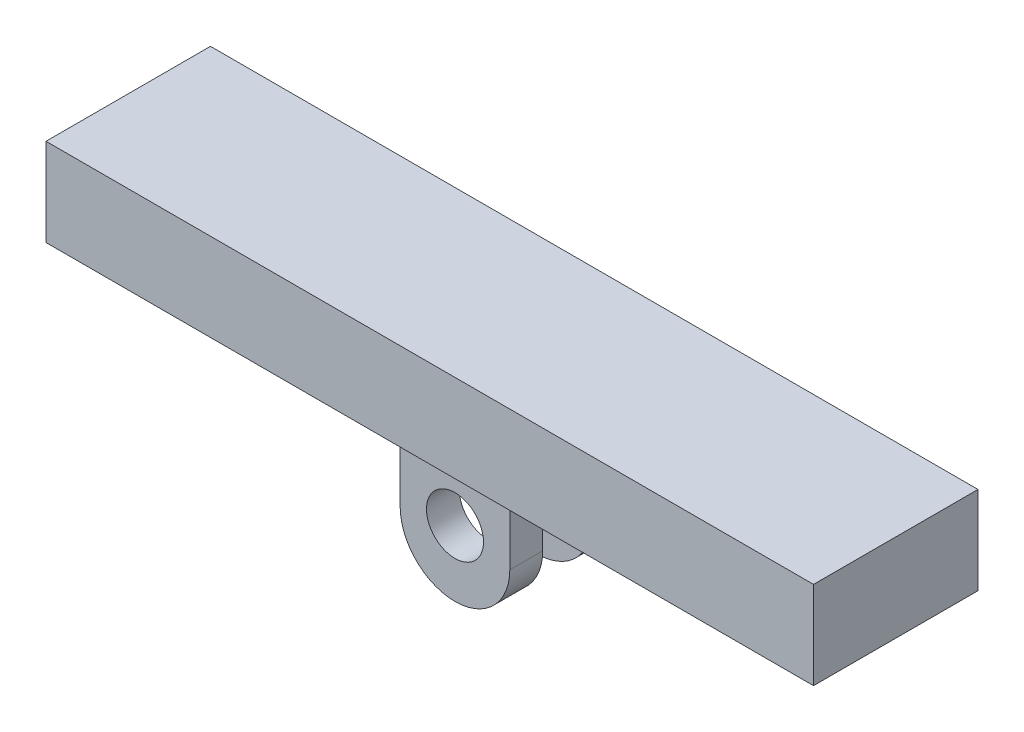
ISO-10303-21;
HEADER;
FILE_DESCRIPTION(('STEP AP214'),'2;1');
FILE_NAME('part.step','',(''),(''),'','','');
FILE_SCHEMA(('AUTOMOTIVE_DESIGN { 1 0 10303 214 1 1 1 1 }'));
ENDSEC;
DATA;
#1=APPLICATION_CONTEXT('core data for automotive mechanical design processes');
#2=APPLICATION_PROTOCOL_DEFINITION('international standard','automotive_design',2000,#1);
#3=PRODUCT_CONTEXT('',#1,'mechanical');
#4=PRODUCT('Part','Part','',(#3));
#5=PRODUCT_RELATED_PRODUCT_CATEGORY('part','',(#4));
#6=PRODUCT_DEFINITION_FORMATION('','',#4);
#7=PRODUCT_DEFINITION_CONTEXT('part definition',#1,'design');
#8=PRODUCT_DEFINITION('design','',#6,#7);
#9=PRODUCT_DEFINITION_SHAPE('','',#8);
#10=(LENGTH_UNIT() NAMED_UNIT(*) SI_UNIT(.MILLI.,.METRE.));
#11=(NAMED_UNIT(*) PLANE_ANGLE_UNIT() SI_UNIT($,.RADIAN.));
#12=(NAMED_UNIT(*) SI_UNIT($,.STERADIAN.) SOLID_ANGLE_UNIT());
#13=UNCERTAINTY_MEASURE_WITH_UNIT(LENGTH_MEASURE(1.E-05),#10,'distance_accuracy_value','');
#14=(GEOMETRIC_REPRESENTATION_CONTEXT(3) GLOBAL_UNCERTAINTY_ASSIGNED_CONTEXT((#13)) GLOBAL_UNIT_ASSIGNED_CONTEXT((#10,
#11,#12)) REPRESENTATION_CONTEXT('',''));
#15=CARTESIAN_POINT('',(0.,0.,0.));
#16=DIRECTION('',(0.,0.,1.));
#17=DIRECTION('',(1.,0.,0.));
#18=AXIS2_PLACEMENT_3D('',#15,#16,#17);
#19=CARTESIAN_POINT('',(-24.5,-2.96691783114937,-12.7508874073065));
#20=DIRECTION('',(0.,-1.,0.));
#21=DIRECTION('',(1.,0.,0.));
#22=AXIS2_PLACEMENT_3D('',#19,#20,#21);
#23=PLANE('',#22);
#24=DIRECTION('',(1.,0.,0.));
#25=VECTOR('',#24,1.);
#26=CARTESIAN_POINT('',(-24.5,-2.96691783114937,-2.25088740730654));
#27=LINE('',#26,#25);
#28=CARTESIAN_POINT('',(-24.5,-2.96691783114937,-2.25088740730654));
#29=VERTEX_POINT('',#28);
#30=CARTESIAN_POINT('',(24.5,-2.96691783114937,-2.25088740730654));
#31=VERTEX_POINT('',#30);
#32=EDGE_CURVE('E217',#29,#31,#27,.T.);
#33=ORIENTED_EDGE('',*,*,#32,.F.);
#34=DIRECTION('',(0.,0.,1.));
#35=VECTOR('',#34,1.);
#36=CARTESIAN_POINT('',(-24.5,-2.96691783114937,-12.7508874073065));
#37=LINE('',#36,#35);
#38=CARTESIAN_POINT('',(-24.5,-2.96691783114937,-12.7508874073065));
#39=VERTEX_POINT('',#38);
#40=EDGE_CURVE('E227',#39,#29,#37,.T.);
#41=ORIENTED_EDGE('',*,*,#40,.F.);
#42=DIRECTION('',(1.,0.,0.));
#43=VECTOR('',#42,1.);
#44=CARTESIAN_POINT('',(-24.5,-2.96691783114937,-12.7508874073065));
#45=LINE('',#44,#43);
#46=CARTESIAN_POINT('',(24.5,-2.96691783114937,-12.7508874073065));
#47=VERTEX_POINT('',#46);
#48=EDGE_CURVE('E205',#39,#47,#45,.T.);
#49=ORIENTED_EDGE('',*,*,#48,.T.);
#50=DIRECTION('',(0.,0.,1.));
#51=VECTOR('',#50,1.);
#52=CARTESIAN_POINT('',(24.5,-2.96691783114937,-12.7508874073065));
#53=LINE('',#52,#51);
#54=EDGE_CURVE('E225',#47,#31,#53,.T.);
#55=ORIENTED_EDGE('',*,*,#54,.T.);
#56=EDGE_LOOP('',(#33,#41,#49,#55));
#57=FACE_BOUND('',#56,.T.);
#58=DIRECTION('',(-1.,0.,0.));
#59=VECTOR('',#58,1.);
#60=CARTESIAN_POINT('',(-3.49999999999999,-2.96691783114937,-9.11088740730654));
#61=LINE('',#60,#59);
#62=CARTESIAN_POINT('',(3.50000000000001,-2.96691783114937,-9.11088740730654));
#63=VERTEX_POINT('',#62);
#64=CARTESIAN_POINT('',(-3.49999999999999,-2.96691783114937,-9.11088740730654));
#65=VERTEX_POINT('',#64);
#66=EDGE_CURVE('E193',#63,#65,#61,.T.);
#67=ORIENTED_EDGE('',*,*,#66,.F.);
#68=DIRECTION('',(0.,0.,1.));
#69=VECTOR('',#68,1.);
#70=CARTESIAN_POINT('',(3.50000000000001,-2.96691783114937,-9.11088740730654));
#71=LINE('',#70,#69);
#72=CARTESIAN_POINT('',(3.5,-2.96691783114937,-11.2108874073065));
#73=VERTEX_POINT('',#72);
#74=EDGE_CURVE('E164',#73,#63,#71,.T.);
#75=ORIENTED_EDGE('',*,*,#74,.F.);
#76=DIRECTION('',(1.,0.,0.));
#77=VECTOR('',#76,1.);
#78=CARTESIAN_POINT('',(-3.49999999999999,-2.96691783114937,-11.2108874073065));
#79=LINE('',#78,#77);
#80=CARTESIAN_POINT('',(-3.49999999999999,-2.96691783114937,-11.2108874073065));
#81=VERTEX_POINT('',#80);
#82=EDGE_CURVE('E187',#81,#73,#79,.T.);
#83=ORIENTED_EDGE('',*,*,#82,.F.);
#84=DIRECTION('',(0.,0.,-1.));
#85=VECTOR('',#84,1.);
#86=CARTESIAN_POINT('',(-3.49999999999999,-2.96691783114937,-9.11088740730654));
#87=LINE('',#86,#85);
#88=EDGE_CURVE('E190',#65,#81,#87,.T.);
#89=ORIENTED_EDGE('',*,*,#88,.F.);
#90=EDGE_LOOP('',(#67,#75,#83,#89));
#91=FACE_BOUND('',#90,.T.);
#92=DIRECTION('',(-1.,0.,0.));
#93=VECTOR('',#92,1.);
#94=CARTESIAN_POINT('',(-3.5,-2.96691783114937,-3.86088740730654));
#95=LINE('',#94,#93);
#96=CARTESIAN_POINT('',(3.5,-2.96691783114937,-3.86088740730654));
#97=VERTEX_POINT('',#96);
#98=CARTESIAN_POINT('',(-3.5,-2.96691783114937,-3.86088740730654));
#99=VERTEX_POINT('',#98);
#100=EDGE_CURVE('E147',#97,#99,#95,.T.);
#101=ORIENTED_EDGE('',*,*,#100,.F.);
#102=DIRECTION('',(0.,0.,1.));
#103=VECTOR('',#102,1.);
#104=CARTESIAN_POINT('',(3.5,-2.96691783114937,-3.86088740730654));
#105=LINE('',#104,#103);
#106=CARTESIAN_POINT('',(3.5,-2.96691783114937,-5.96088740730654));
#107=VERTEX_POINT('',#106);
#108=EDGE_CURVE('E158',#107,#97,#105,.T.);
#109=ORIENTED_EDGE('',*,*,#108,.F.);
#110=DIRECTION('',(1.,0.,0.));
#111=VECTOR('',#110,1.);
#112=CARTESIAN_POINT('',(-3.5,-2.96691783114937,-5.96088740730654));
#113=LINE('',#112,#111);
#114=CARTESIAN_POINT('',(-3.5,-2.96691783114937,-5.96088740730654));
#115=VERTEX_POINT('',#114);
#116=EDGE_CURVE('E169',#115,#107,#113,.T.);
#117=ORIENTED_EDGE('',*,*,#116,.F.);
#118=DIRECTION('',(0.,0.,-1.));
#119=VECTOR('',#118,1.);
#120=CARTESIAN_POINT('',(-3.5,-2.96691783114937,-3.86088740730654));
#121=LINE('',#120,#119);
#122=EDGE_CURVE('E167',#99,#115,#121,.T.);
#123=ORIENTED_EDGE('',*,*,#122,.F.);
#124=EDGE_LOOP('',(#101,#109,#117,#123));
#125=FACE_BOUND('',#124,.T.);
#126=ADVANCED_FACE('F43',(#57,#91,#125),#23,.T.);
#127=CARTESIAN_POINT('',(-24.5,2.63308216885063,-12.7508874073065));
#128=DIRECTION('',(0.,1.,0.));
#129=DIRECTION('',(-1.,0.,0.));
#130=AXIS2_PLACEMENT_3D('',#127,#128,#129);
#131=PLANE('',#130);
#132=DIRECTION('',(-1.,0.,0.));
#133=VECTOR('',#132,1.);
#134=CARTESIAN_POINT('',(-24.5,2.63308216885063,-2.25088740730654));
#135=LINE('',#134,#133);
#136=CARTESIAN_POINT('',(24.5,2.63308216885063,-2.25088740730654));
#137=VERTEX_POINT('',#136);
#138=CARTESIAN_POINT('',(-24.5,2.63308216885063,-2.25088740730654));
#139=VERTEX_POINT('',#138);
#140=EDGE_CURVE('E154',#137,#139,#135,.T.);
#141=ORIENTED_EDGE('',*,*,#140,.F.);
#142=DIRECTION('',(0.,0.,1.));
#143=VECTOR('',#142,1.);
#144=CARTESIAN_POINT('',(24.5,2.63308216885063,-12.7508874073065));
#145=LINE('',#144,#143);
#146=CARTESIAN_POINT('',(24.5,2.63308216885063,-12.7508874073065));
#147=VERTEX_POINT('',#146);
#148=EDGE_CURVE('E222',#147,#137,#145,.T.);
#149=ORIENTED_EDGE('',*,*,#148,.F.);
#150=DIRECTION('',(-1.,0.,0.));
#151=VECTOR('',#150,1.);
#152=CARTESIAN_POINT('',(-24.5,2.63308216885063,-12.7508874073065));
#153=LINE('',#152,#151);
#154=CARTESIAN_POINT('',(-24.5,2.63308216885063,-12.7508874073065));
#155=VERTEX_POINT('',#154);
#156=EDGE_CURVE('E198',#147,#155,#153,.T.);
#157=ORIENTED_EDGE('',*,*,#156,.T.);
#158=DIRECTION('',(0.,0.,1.));
#159=VECTOR('',#158,1.);
#160=CARTESIAN_POINT('',(-24.5,2.63308216885063,-12.7508874073065));
#161=LINE('',#160,#159);
#162=EDGE_CURVE('E211',#155,#139,#161,.T.);
#163=ORIENTED_EDGE('',*,*,#162,.T.);
#164=EDGE_LOOP('',(#141,#149,#157,#163));
#165=FACE_BOUND('',#164,.T.);
#166=ADVANCED_FACE('F283',(#165),#131,.T.);
#167=CARTESIAN_POINT('',(24.5,-2.96691783114937,-12.7508874073065));
#168=DIRECTION('',(1.,0.,0.));
#169=DIRECTION('',(0.,0.,-1.));
#170=AXIS2_PLACEMENT_3D('',#167,#168,#169);
#171=PLANE('',#170);
#172=DIRECTION('',(0.,1.,0.));
#173=VECTOR('',#172,1.);
#174=CARTESIAN_POINT('',(24.5,-2.96691783114937,-2.25088740730654));
#175=LINE('',#174,#173);
#176=EDGE_CURVE('E202',#31,#137,#175,.T.);
#177=ORIENTED_EDGE('',*,*,#176,.F.);
#178=ORIENTED_EDGE('',*,*,#54,.F.);
#179=DIRECTION('',(0.,1.,0.));
#180=VECTOR('',#179,1.);
#181=CARTESIAN_POINT('',(24.5,-2.96691783114937,-12.7508874073065));
#182=LINE('',#181,#180);
#183=EDGE_CURVE('E208',#47,#147,#182,.T.);
#184=ORIENTED_EDGE('',*,*,#183,.T.);
#185=ORIENTED_EDGE('',*,*,#148,.T.);
#186=EDGE_LOOP('',(#177,#178,#184,#185));
#187=FACE_BOUND('',#186,.T.);
#188=ADVANCED_FACE('F289',(#187),#171,.T.);
#189=CARTESIAN_POINT('',(-24.5,-2.96691783114937,-12.7508874073065));
#190=DIRECTION('',(-1.,0.,0.));
#191=DIRECTION('',(0.,0.,1.));
#192=AXIS2_PLACEMENT_3D('',#189,#190,#191);
#193=PLANE('',#192);
#194=DIRECTION('',(0.,-1.,0.));
#195=VECTOR('',#194,1.);
#196=CARTESIAN_POINT('',(-24.5,-2.96691783114937,-2.25088740730654));
#197=LINE('',#196,#195);
#198=EDGE_CURVE('E214',#139,#29,#197,.T.);
#199=ORIENTED_EDGE('',*,*,#198,.F.);
#200=ORIENTED_EDGE('',*,*,#162,.F.);
#201=DIRECTION('',(0.,-1.,0.));
#202=VECTOR('',#201,1.);
#203=CARTESIAN_POINT('',(-24.5,-2.96691783114937,-12.7508874073065));
#204=LINE('',#203,#202);
#205=EDGE_CURVE('E201',#155,#39,#204,.T.);
#206=ORIENTED_EDGE('',*,*,#205,.T.);
#207=ORIENTED_EDGE('',*,*,#40,.T.);
#208=EDGE_LOOP('',(#199,#200,#206,#207));
#209=FACE_BOUND('',#208,.T.);
#210=ADVANCED_FACE('F297',(#209),#193,.T.);
#211=CARTESIAN_POINT('',(0.,-0.166917831149369,-12.7508874073065));
#212=DIRECTION('',(0.,0.,1.));
#213=DIRECTION('',(1.,0.,0.));
#214=AXIS2_PLACEMENT_3D('',#211,#212,#213);
#215=PLANE('',#214);
#216=ORIENTED_EDGE('',*,*,#156,.F.);
#217=ORIENTED_EDGE('',*,*,#183,.F.);
#218=ORIENTED_EDGE('',*,*,#48,.F.);
#219=ORIENTED_EDGE('',*,*,#205,.F.);
#220=EDGE_LOOP('',(#216,#217,#218,#219));
#221=FACE_BOUND('',#220,.T.);
#222=ADVANCED_FACE('F299',(#221),#215,.F.);
#223=CARTESIAN_POINT('',(0.,-0.166917831149369,-2.25088740730654));
#224=DIRECTION('',(0.,0.,1.));
#225=DIRECTION('',(1.,0.,0.));
#226=AXIS2_PLACEMENT_3D('',#223,#224,#225);
#227=PLANE('',#226);
#228=ORIENTED_EDGE('',*,*,#140,.T.);
#229=ORIENTED_EDGE('',*,*,#198,.T.);
#230=ORIENTED_EDGE('',*,*,#32,.T.);
#231=ORIENTED_EDGE('',*,*,#176,.T.);
#232=EDGE_LOOP('',(#228,#229,#230,#231));
#233=FACE_BOUND('',#232,.T.);
#234=ADVANCED_FACE('F403',(#233),#227,.T.);
#235=CARTESIAN_POINT('',(3.50000000000001,-11.3669178311494,-9.11088740730654));
#236=DIRECTION('',(-1.,0.,0.));
#237=DIRECTION('',(0.,0.,1.));
#238=AXIS2_PLACEMENT_3D('',#235,#236,#237);
#239=PLANE('',#238);
#240=DIRECTION('',(0.,1.,0.));
#241=VECTOR('',#240,1.);
#242=CARTESIAN_POINT('',(3.50000000000001,-11.3669178311494,-9.11088740730654));
#243=LINE('',#242,#241);
#244=CARTESIAN_POINT('',(3.50000000000001,-7.86691783114937,-9.11088740730654));
#245=VERTEX_POINT('',#244);
#246=EDGE_CURVE('E178',#245,#63,#243,.T.);
#247=ORIENTED_EDGE('',*,*,#246,.F.);
#248=DIRECTION('',(0.,0.,1.));
#249=VECTOR('',#248,1.);
#250=CARTESIAN_POINT('',(3.50000000000001,-7.86691783114937,-11.2108874073065));
#251=LINE('',#250,#249);
#252=CARTESIAN_POINT('',(3.50000000000001,-7.86691783114937,-11.2108874073065));
#253=VERTEX_POINT('',#252);
#254=EDGE_CURVE('E245',#245,#253,#251,.F.);
#255=ORIENTED_EDGE('',*,*,#254,.T.);
#256=DIRECTION('',(0.,1.,0.));
#257=VECTOR('',#256,1.);
#258=CARTESIAN_POINT('',(3.50000000000001,-11.3669178311494,-11.2108874073065));
#259=LINE('',#258,#257);
#260=EDGE_CURVE('E185',#253,#73,#259,.T.);
#261=ORIENTED_EDGE('',*,*,#260,.T.);
#262=ORIENTED_EDGE('',*,*,#74,.T.);
#263=EDGE_LOOP('',(#247,#255,#261,#262));
#264=FACE_BOUND('',#263,.T.);
#265=ADVANCED_FACE('F394',(#264),#239,.F.);
#266=CARTESIAN_POINT('',(-3.49999999999999,-11.3669178311494,-9.11088740730654));
#267=DIRECTION('',(0.,0.,-1.));
#268=DIRECTION('',(-1.,0.,0.));
#269=AXIS2_PLACEMENT_3D('',#266,#267,#268);
#270=PLANE('',#269);
#271=CARTESIAN_POINT('',(0.,-7.16691783114937,-9.11088740730654));
#272=DIRECTION('',(0.,0.,-1.));
#273=DIRECTION('',(-1.,0.,0.));
#274=AXIS2_PLACEMENT_3D('',#271,#272,#273);
#275=CIRCLE('',#274,1.82);
#276=CARTESIAN_POINT('',(-1.82,-7.16691783114937,-9.11088740730654));
#277=VERTEX_POINT('',#276);
#278=EDGE_CURVE('E181',#277,#277,#275,.T.);
#279=ORIENTED_EDGE('',*,*,#278,.T.);
#280=EDGE_LOOP('',(#279));
#281=FACE_BOUND('',#280,.T.);
#282=DIRECTION('',(0.,1.,0.));
#283=VECTOR('',#282,1.);
#284=CARTESIAN_POINT('',(-3.49999999999999,-11.3669178311494,-9.11088740730654));
#285=LINE('',#284,#283);
#286=CARTESIAN_POINT('',(-3.49999999999999,-7.86691783114937,-9.11088740730654));
#287=VERTEX_POINT('',#286);
#288=EDGE_CURVE('E180',#287,#65,#285,.T.);
#289=ORIENTED_EDGE('',*,*,#288,.F.);
#290=CARTESIAN_POINT('',(0.,-7.86691783114937,-9.11088740730654));
#291=DIRECTION('',(0.,0.,-1.));
#292=DIRECTION('',(-1.,0.,0.));
#293=AXIS2_PLACEMENT_3D('',#290,#291,#292);
#294=CIRCLE('',#293,3.5);
#295=CARTESIAN_POINT('',(0.,-11.3669178311494,-9.11088740730654));
#296=VERTEX_POINT('',#295);
#297=EDGE_CURVE('E243',#287,#296,#294,.F.);
#298=ORIENTED_EDGE('',*,*,#297,.T.);
#299=CARTESIAN_POINT('',(0.,-7.86691783114937,-9.11088740730654));
#300=DIRECTION('',(0.,0.,-1.));
#301=DIRECTION('',(-1.,0.,0.));
#302=AXIS2_PLACEMENT_3D('',#299,#300,#301);
#303=CIRCLE('',#302,3.5);
#304=EDGE_CURVE('E241',#296,#245,#303,.F.);
#305=ORIENTED_EDGE('',*,*,#304,.T.);
#306=ORIENTED_EDGE('',*,*,#246,.T.);
#307=ORIENTED_EDGE('',*,*,#66,.T.);
#308=EDGE_LOOP('',(#289,#298,#305,#306,#307));
#309=FACE_BOUND('',#308,.T.);
#310=ADVANCED_FACE('F384',(#281,#309),#270,.F.);
#311=CARTESIAN_POINT('',(-3.49999999999999,-11.3669178311494,-9.11088740730654));
#312=DIRECTION('',(1.,0.,0.));
#313=DIRECTION('',(0.,1.,0.));
#314=AXIS2_PLACEMENT_3D('',#311,#312,#313);
#315=PLANE('',#314);
#316=DIRECTION('',(0.,1.,0.));
#317=VECTOR('',#316,1.);
#318=CARTESIAN_POINT('',(-3.49999999999999,-11.3669178311494,-11.2108874073065));
#319=LINE('',#318,#317);
#320=CARTESIAN_POINT('',(-3.49999999999999,-7.86691783114937,-11.2108874073065));
#321=VERTEX_POINT('',#320);
#322=EDGE_CURVE('E183',#321,#81,#319,.T.);
#323=ORIENTED_EDGE('',*,*,#322,.F.);
#324=DIRECTION('',(0.,0.,-1.));
#325=VECTOR('',#324,1.);
#326=CARTESIAN_POINT('',(-3.49999999999999,-7.86691783114937,-9.11088740730654));
#327=LINE('',#326,#325);
#328=EDGE_CURVE('E238',#321,#287,#327,.F.);
#329=ORIENTED_EDGE('',*,*,#328,.T.);
#330=ORIENTED_EDGE('',*,*,#288,.T.);
#331=ORIENTED_EDGE('',*,*,#88,.T.);
#332=EDGE_LOOP('',(#323,#329,#330,#331));
#333=FACE_BOUND('',#332,.T.);
#334=ADVANCED_FACE('F374',(#333),#315,.F.);
#335=CARTESIAN_POINT('',(-3.49999999999999,-11.3669178311494,-11.2108874073065));
#336=DIRECTION('',(0.,0.,1.));
#337=DIRECTION('',(1.,0.,0.));
#338=AXIS2_PLACEMENT_3D('',#335,#336,#337);
#339=PLANE('',#338);
#340=CARTESIAN_POINT('',(0.,-7.16691783114937,-11.2108874073065));
#341=DIRECTION('',(0.,0.,1.));
#342=DIRECTION('',(1.,0.,0.));
#343=AXIS2_PLACEMENT_3D('',#340,#341,#342);
#344=CIRCLE('',#343,1.82);
#345=CARTESIAN_POINT('',(1.82,-7.16691783114937,-11.2108874073065));
#346=VERTEX_POINT('',#345);
#347=EDGE_CURVE('E233',#346,#346,#344,.T.);
#348=ORIENTED_EDGE('',*,*,#347,.T.);
#349=EDGE_LOOP('',(#348));
#350=FACE_BOUND('',#349,.T.);
#351=CARTESIAN_POINT('',(0.,-7.86691783114937,-11.2108874073065));
#352=DIRECTION('',(0.,0.,1.));
#353=DIRECTION('',(1.,0.,0.));
#354=AXIS2_PLACEMENT_3D('',#351,#352,#353);
#355=CIRCLE('',#354,3.5);
#356=CARTESIAN_POINT('',(0.,-11.3669178311494,-11.2108874073065));
#357=VERTEX_POINT('',#356);
#358=EDGE_CURVE('E224',#253,#357,#355,.F.);
#359=ORIENTED_EDGE('',*,*,#358,.T.);
#360=CARTESIAN_POINT('',(0.,-7.86691783114937,-11.2108874073065));
#361=DIRECTION('',(0.,0.,1.));
#362=DIRECTION('',(1.,0.,0.));
#363=AXIS2_PLACEMENT_3D('',#360,#361,#362);
#364=CIRCLE('',#363,3.5);
#365=EDGE_CURVE('E236',#357,#321,#364,.F.);
#366=ORIENTED_EDGE('',*,*,#365,.T.);
#367=ORIENTED_EDGE('',*,*,#322,.T.);
#368=ORIENTED_EDGE('',*,*,#82,.T.);
#369=ORIENTED_EDGE('',*,*,#260,.F.);
#370=EDGE_LOOP('',(#359,#366,#367,#368,#369));
#371=FACE_BOUND('',#370,.T.);
#372=ADVANCED_FACE('F365',(#350,#371),#339,.F.);
#373=CARTESIAN_POINT('',(3.5,-11.3669178311494,-3.86088740730654));
#374=DIRECTION('',(-1.,0.,0.));
#375=DIRECTION('',(0.,0.,1.));
#376=AXIS2_PLACEMENT_3D('',#373,#374,#375);
#377=PLANE('',#376);
#378=DIRECTION('',(0.,1.,0.));
#379=VECTOR('',#378,1.);
#380=CARTESIAN_POINT('',(3.5,-11.3669178311494,-3.86088740730654));
#381=LINE('',#380,#379);
#382=CARTESIAN_POINT('',(3.5,-7.86691783114937,-3.86088740730654));
#383=VERTEX_POINT('',#382);
#384=EDGE_CURVE('E142',#383,#97,#381,.T.);
#385=ORIENTED_EDGE('',*,*,#384,.F.);
#386=DIRECTION('',(0.,0.,1.));
#387=VECTOR('',#386,1.);
#388=CARTESIAN_POINT('',(3.5,-7.86691783114937,-5.96088740730654));
#389=LINE('',#388,#387);
#390=CARTESIAN_POINT('',(3.5,-7.86691783114937,-5.96088740730654));
#391=VERTEX_POINT('',#390);
#392=EDGE_CURVE('E250',#383,#391,#389,.F.);
#393=ORIENTED_EDGE('',*,*,#392,.T.);
#394=DIRECTION('',(0.,1.,0.));
#395=VECTOR('',#394,1.);
#396=CARTESIAN_POINT('',(3.5,-11.3669178311494,-5.96088740730654));
#397=LINE('',#396,#395);
#398=EDGE_CURVE('E160',#391,#107,#397,.T.);
#399=ORIENTED_EDGE('',*,*,#398,.T.);
#400=ORIENTED_EDGE('',*,*,#108,.T.);
#401=EDGE_LOOP('',(#385,#393,#399,#400));
#402=FACE_BOUND('',#401,.T.);
#403=ADVANCED_FACE('F159',(#402),#377,.F.);
#404=CARTESIAN_POINT('',(-3.5,-11.3669178311494,-3.86088740730654));
#405=DIRECTION('',(0.,0.,-1.));
#406=DIRECTION('',(-1.,0.,0.));
#407=AXIS2_PLACEMENT_3D('',#404,#405,#406);
#408=PLANE('',#407);
#409=CARTESIAN_POINT('',(0.,-7.16691783114937,-3.86088740730654));
#410=DIRECTION('',(0.,0.,1.));
#411=DIRECTION('',(1.,0.,0.));
#412=AXIS2_PLACEMENT_3D('',#409,#410,#411);
#413=CIRCLE('',#412,1.82);
#414=CARTESIAN_POINT('',(1.82,-7.16691783114937,-3.86088740730654));
#415=VERTEX_POINT('',#414);
#416=EDGE_CURVE('E234',#415,#415,#413,.T.);
#417=ORIENTED_EDGE('',*,*,#416,.F.);
#418=EDGE_LOOP('',(#417));
#419=FACE_BOUND('',#418,.T.);
#420=CARTESIAN_POINT('',(0.,-7.86691783114937,-3.86088740730654));
#421=DIRECTION('',(0.,0.,-1.));
#422=DIRECTION('',(-1.,0.,0.));
#423=AXIS2_PLACEMENT_3D('',#420,#421,#422);
#424=CIRCLE('',#423,3.5);
#425=CARTESIAN_POINT('',(-3.5,-7.86691783114937,-3.86088740730654));
#426=VERTEX_POINT('',#425);
#427=CARTESIAN_POINT('',(0.,-11.3669178311494,-3.86088740730654));
#428=VERTEX_POINT('',#427);
#429=EDGE_CURVE('E247',#426,#428,#424,.F.);
#430=ORIENTED_EDGE('',*,*,#429,.T.);
#431=CARTESIAN_POINT('',(0.,-7.86691783114937,-3.86088740730654));
#432=DIRECTION('',(0.,0.,-1.));
#433=DIRECTION('',(-1.,0.,0.));
#434=AXIS2_PLACEMENT_3D('',#431,#432,#433);
#435=CIRCLE('',#434,3.5);
#436=EDGE_CURVE('E150',#428,#383,#435,.F.);
#437=ORIENTED_EDGE('',*,*,#436,.T.);
#438=ORIENTED_EDGE('',*,*,#384,.T.);
#439=ORIENTED_EDGE('',*,*,#100,.T.);
#440=DIRECTION('',(0.,1.,0.));
#441=VECTOR('',#440,1.);
#442=CARTESIAN_POINT('',(-3.5,-11.3669178311494,-3.86088740730654));
#443=LINE('',#442,#441);
#444=EDGE_CURVE('E155',#426,#99,#443,.T.);
#445=ORIENTED_EDGE('',*,*,#444,.F.);
#446=EDGE_LOOP('',(#430,#437,#438,#439,#445));
#447=FACE_BOUND('',#446,.T.);
#448=ADVANCED_FACE('F144',(#419,#447),#408,.F.);
#449=CARTESIAN_POINT('',(-3.5,-11.3669178311494,-3.86088740730654));
#450=DIRECTION('',(1.,0.,0.));
#451=DIRECTION('',(0.,0.,-1.));
#452=AXIS2_PLACEMENT_3D('',#449,#450,#451);
#453=PLANE('',#452);
#454=DIRECTION('',(0.,1.,0.));
#455=VECTOR('',#454,1.);
#456=CARTESIAN_POINT('',(-3.5,-11.3669178311494,-5.96088740730654));
#457=LINE('',#456,#455);
#458=CARTESIAN_POINT('',(-3.5,-7.86691783114937,-5.96088740730654));
#459=VERTEX_POINT('',#458);
#460=EDGE_CURVE('E175',#459,#115,#457,.T.);
#461=ORIENTED_EDGE('',*,*,#460,.F.);
#462=DIRECTION('',(0.,0.,-1.));
#463=VECTOR('',#462,1.);
#464=CARTESIAN_POINT('',(-3.5,-7.86691783114937,-3.86088740730654));
#465=LINE('',#464,#463);
#466=EDGE_CURVE('E12',#459,#426,#465,.F.);
#467=ORIENTED_EDGE('',*,*,#466,.T.);
#468=ORIENTED_EDGE('',*,*,#444,.T.);
#469=ORIENTED_EDGE('',*,*,#122,.T.);
#470=EDGE_LOOP('',(#461,#467,#468,#469));
#471=FACE_BOUND('',#470,.T.);
#472=ADVANCED_FACE('F268',(#471),#453,.F.);
#473=CARTESIAN_POINT('',(-3.5,-11.3669178311494,-5.96088740730654));
#474=DIRECTION('',(0.,0.,1.));
#475=DIRECTION('',(1.,0.,0.));
#476=AXIS2_PLACEMENT_3D('',#473,#474,#475);
#477=PLANE('',#476);
#478=CARTESIAN_POINT('',(0.,-7.16691783114937,-5.96088740730654));
#479=DIRECTION('',(0.,0.,1.));
#480=DIRECTION('',(1.,0.,0.));
#481=AXIS2_PLACEMENT_3D('',#478,#479,#480);
#482=CIRCLE('',#481,1.82);
#483=CARTESIAN_POINT('',(1.82,-7.16691783114937,-5.96088740730654));
#484=VERTEX_POINT('',#483);
#485=EDGE_CURVE('E230',#484,#484,#482,.T.);
#486=ORIENTED_EDGE('',*,*,#485,.T.);
#487=EDGE_LOOP('',(#486));
#488=FACE_BOUND('',#487,.T.);
#489=ORIENTED_EDGE('',*,*,#398,.F.);
#490=CARTESIAN_POINT('',(0.,-7.86691783114937,-5.96088740730654));
#491=DIRECTION('',(0.,0.,1.));
#492=DIRECTION('',(1.,0.,0.));
#493=AXIS2_PLACEMENT_3D('',#490,#491,#492);
#494=CIRCLE('',#493,3.5);
#495=CARTESIAN_POINT('',(0.,-11.3669178311494,-5.96088740730654));
#496=VERTEX_POINT('',#495);
#497=EDGE_CURVE('E52',#391,#496,#494,.F.);
#498=ORIENTED_EDGE('',*,*,#497,.T.);
#499=CARTESIAN_POINT('',(0.,-7.86691783114937,-5.96088740730654));
#500=DIRECTION('',(0.,0.,1.));
#501=DIRECTION('',(1.,0.,0.));
#502=AXIS2_PLACEMENT_3D('',#499,#500,#501);
#503=CIRCLE('',#502,3.5);
#504=EDGE_CURVE('E60',#496,#459,#503,.F.);
#505=ORIENTED_EDGE('',*,*,#504,.T.);
#506=ORIENTED_EDGE('',*,*,#460,.T.);
#507=ORIENTED_EDGE('',*,*,#116,.T.);
#508=EDGE_LOOP('',(#489,#498,#505,#506,#507));
#509=FACE_BOUND('',#508,.T.);
#510=ADVANCED_FACE('F269',(#488,#509),#477,.F.);
#511=CARTESIAN_POINT('',(0.,-7.16691783114937,-12.2608874073065));
#512=DIRECTION('',(0.,0.,1.));
#513=DIRECTION('',(1.,0.,0.));
#514=AXIS2_PLACEMENT_3D('',#511,#512,#513);
#515=CYLINDRICAL_SURFACE('',#514,1.82);
#516=ORIENTED_EDGE('',*,*,#416,.T.);
#517=EDGE_LOOP('',(#516));
#518=FACE_BOUND('',#517,.T.);
#519=ORIENTED_EDGE('',*,*,#485,.F.);
#520=EDGE_LOOP('',(#519));
#521=FACE_BOUND('',#520,.T.);
#522=ADVANCED_FACE('F271',(#518,#521),#515,.F.);
#523=ORIENTED_EDGE('',*,*,#347,.F.);
#524=EDGE_LOOP('',(#523));
#525=FACE_BOUND('',#524,.T.);
#526=ORIENTED_EDGE('',*,*,#278,.F.);
#527=EDGE_LOOP('',(#526));
#528=FACE_BOUND('',#527,.T.);
#529=ADVANCED_FACE('F278',(#525,#528),#515,.F.);
#530=CARTESIAN_POINT('',(0.,-7.86691783114937,-2.25088740730654));
#531=DIRECTION('',(0.,0.,-1.));
#532=DIRECTION('',(-1.,0.,0.));
#533=AXIS2_PLACEMENT_3D('',#530,#531,#532);
#534=CYLINDRICAL_SURFACE('',#533,3.5);
#535=ORIENTED_EDGE('',*,*,#254,.F.);
#536=ORIENTED_EDGE('',*,*,#304,.F.);
#537=DIRECTION('',(0.,0.,1.));
#538=VECTOR('',#537,1.);
#539=CARTESIAN_POINT('',(0.,-11.3669178311494,-9.11088740730654));
#540=LINE('',#539,#538);
#541=EDGE_CURVE('E253',#357,#296,#540,.T.);
#542=ORIENTED_EDGE('',*,*,#541,.F.);
#543=ORIENTED_EDGE('',*,*,#358,.F.);
#544=EDGE_LOOP('',(#535,#536,#542,#543));
#545=FACE_BOUND('',#544,.T.);
#546=ADVANCED_FACE('F305',(#545),#534,.T.);
#547=CARTESIAN_POINT('',(0.,-7.86691783114937,-2.25088740730654));
#548=DIRECTION('',(0.,0.,1.));
#549=DIRECTION('',(0.,-1.,0.));
#550=AXIS2_PLACEMENT_3D('',#547,#548,#549);
#551=CYLINDRICAL_SURFACE('',#550,3.5);
#552=ORIENTED_EDGE('',*,*,#297,.F.);
#553=ORIENTED_EDGE('',*,*,#328,.F.);
#554=ORIENTED_EDGE('',*,*,#365,.F.);
#555=ORIENTED_EDGE('',*,*,#541,.T.);
#556=EDGE_LOOP('',(#552,#553,#554,#555));
#557=FACE_BOUND('',#556,.T.);
#558=ADVANCED_FACE('F302',(#557),#551,.T.);
#559=CARTESIAN_POINT('',(0.,-7.86691783114937,-2.25088740730654));
#560=DIRECTION('',(0.,0.,1.));
#561=DIRECTION('',(1.,0.,0.));
#562=AXIS2_PLACEMENT_3D('',#559,#560,#561);
#563=CYLINDRICAL_SURFACE('',#562,3.5);
#564=ORIENTED_EDGE('',*,*,#466,.F.);
#565=ORIENTED_EDGE('',*,*,#504,.F.);
#566=DIRECTION('',(0.,0.,-1.));
#567=VECTOR('',#566,1.);
#568=CARTESIAN_POINT('',(0.,-11.3669178311494,-5.96088740730654));
#569=LINE('',#568,#567);
#570=EDGE_CURVE('E47',#428,#496,#569,.T.);
#571=ORIENTED_EDGE('',*,*,#570,.F.);
#572=ORIENTED_EDGE('',*,*,#429,.F.);
#573=EDGE_LOOP('',(#564,#565,#571,#572));
#574=FACE_BOUND('',#573,.T.);
#575=ADVANCED_FACE('F45',(#574),#563,.T.);
#576=CARTESIAN_POINT('',(0.,-7.86691783114937,-2.25088740730654));
#577=DIRECTION('',(0.,0.,-1.));
#578=DIRECTION('',(-1.,0.,0.));
#579=AXIS2_PLACEMENT_3D('',#576,#577,#578);
#580=CYLINDRICAL_SURFACE('',#579,3.5);
#581=ORIENTED_EDGE('',*,*,#497,.F.);
#582=ORIENTED_EDGE('',*,*,#392,.F.);
#583=ORIENTED_EDGE('',*,*,#436,.F.);
#584=ORIENTED_EDGE('',*,*,#570,.T.);
#585=EDGE_LOOP('',(#581,#582,#583,#584));
#586=FACE_BOUND('',#585,.T.);
#587=ADVANCED_FACE('F263',(#586),#580,.T.);
#588=CLOSED_SHELL('',(#126,#166,#188,#210,#222,#234,#265,#310,#334,#372,#403,#448,#472,#510,
#522,#529,#546,#558,#575,#587));
#589=MANIFOLD_SOLID_BREP('B2',#588);
#590=ADVANCED_BREP_SHAPE_REPRESENTATION('',(#18,#589),#14);
#591=SHAPE_DEFINITION_REPRESENTATION(#9,#590);
ENDSEC;
END-ISO-10303-21;
